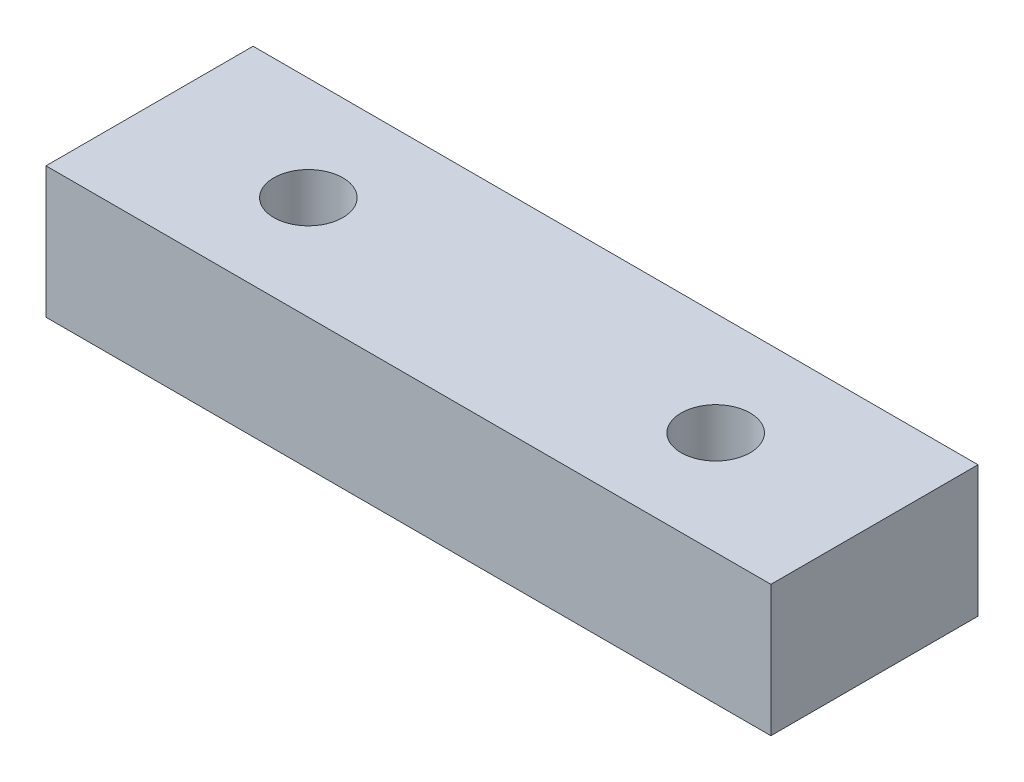
ISO-10303-21;
HEADER;
FILE_DESCRIPTION(('STEP AP214'),'2;1');
FILE_NAME('part.step','',(''),(''),'','','');
FILE_SCHEMA(('AUTOMOTIVE_DESIGN { 1 0 10303 214 1 1 1 1 }'));
ENDSEC;
DATA;
#1=APPLICATION_CONTEXT('core data for automotive mechanical design processes');
#2=APPLICATION_PROTOCOL_DEFINITION('international standard','automotive_design',2000,#1);
#3=PRODUCT_CONTEXT('',#1,'mechanical');
#4=PRODUCT('Part','Part','',(#3));
#5=PRODUCT_RELATED_PRODUCT_CATEGORY('part','',(#4));
#6=PRODUCT_DEFINITION_FORMATION('','',#4);
#7=PRODUCT_DEFINITION_CONTEXT('part definition',#1,'design');
#8=PRODUCT_DEFINITION('design','',#6,#7);
#9=PRODUCT_DEFINITION_SHAPE('','',#8);
#10=(LENGTH_UNIT() NAMED_UNIT(*) SI_UNIT(.MILLI.,.METRE.));
#11=(NAMED_UNIT(*) PLANE_ANGLE_UNIT() SI_UNIT($,.RADIAN.));
#12=(NAMED_UNIT(*) SI_UNIT($,.STERADIAN.) SOLID_ANGLE_UNIT());
#13=UNCERTAINTY_MEASURE_WITH_UNIT(LENGTH_MEASURE(1.E-05),#10,'distance_accuracy_value','');
#14=(GEOMETRIC_REPRESENTATION_CONTEXT(3) GLOBAL_UNCERTAINTY_ASSIGNED_CONTEXT((#13)) GLOBAL_UNIT_ASSIGNED_CONTEXT((#10,
#11,#12)) REPRESENTATION_CONTEXT('',''));
#15=CARTESIAN_POINT('',(0.,0.,0.));
#16=DIRECTION('',(0.,0.,1.));
#17=DIRECTION('',(1.,0.,0.));
#18=AXIS2_PLACEMENT_3D('',#15,#16,#17);
#19=CARTESIAN_POINT('',(0.,3.8,0.));
#20=DIRECTION('',(0.,-1.,0.));
#21=DIRECTION('',(0.,0.,-1.));
#22=AXIS2_PLACEMENT_3D('',#19,#20,#21);
#23=PLANE('',#22);
#24=DIRECTION('',(0.,0.,1.));
#25=VECTOR('',#24,1.);
#26=CARTESIAN_POINT('',(-73.0102049309709,3.8,-3.59999999999999));
#27=LINE('',#26,#25);
#28=CARTESIAN_POINT('',(-73.0102049309709,3.8,-9.59999999999999));
#29=VERTEX_POINT('',#28);
#30=CARTESIAN_POINT('',(-73.0102049309709,3.8,-3.59999999999999));
#31=VERTEX_POINT('',#30);
#32=EDGE_CURVE('E92',#29,#31,#27,.T.);
#33=ORIENTED_EDGE('',*,*,#32,.T.);
#34=DIRECTION('',(1.,0.,0.));
#35=VECTOR('',#34,1.);
#36=CARTESIAN_POINT('',(-73.0102049309709,3.8,-3.59999999999999));
#37=LINE('',#36,#35);
#38=CARTESIAN_POINT('',(-52.0102049309709,3.8,-3.59999999999999));
#39=VERTEX_POINT('',#38);
#40=EDGE_CURVE('E87',#31,#39,#37,.T.);
#41=ORIENTED_EDGE('',*,*,#40,.T.);
#42=DIRECTION('',(0.,0.,-1.));
#43=VECTOR('',#42,1.);
#44=CARTESIAN_POINT('',(-52.0102049309709,3.8,-3.59999999999999));
#45=LINE('',#44,#43);
#46=CARTESIAN_POINT('',(-52.0102049309709,3.8,-9.6));
#47=VERTEX_POINT('',#46);
#48=EDGE_CURVE('E90',#39,#47,#45,.T.);
#49=ORIENTED_EDGE('',*,*,#48,.T.);
#50=DIRECTION('',(-1.,0.,0.));
#51=VECTOR('',#50,1.);
#52=CARTESIAN_POINT('',(-73.0102049309709,3.8,-9.59999999999999));
#53=LINE('',#52,#51);
#54=EDGE_CURVE('E57',#47,#29,#53,.T.);
#55=ORIENTED_EDGE('',*,*,#54,.T.);
#56=EDGE_LOOP('',(#33,#41,#49,#55));
#57=FACE_BOUND('',#56,.T.);
#58=CARTESIAN_POINT('',(-56.6102049309709,3.8,-6.59999999999999));
#59=DIRECTION('',(0.,1.,0.));
#60=DIRECTION('',(0.,0.,1.));
#61=AXIS2_PLACEMENT_3D('',#58,#59,#60);
#62=CIRCLE('',#61,0.999999999999998);
#63=CARTESIAN_POINT('',(-56.6102049309709,3.8,-7.59999999999999));
#64=VERTEX_POINT('',#63);
#65=EDGE_CURVE('E112',#64,#64,#62,.T.);
#66=ORIENTED_EDGE('',*,*,#65,.F.);
#67=EDGE_LOOP('',(#66));
#68=FACE_BOUND('',#67,.T.);
#69=CARTESIAN_POINT('',(-68.4102049309709,3.8,-6.59999999999999));
#70=DIRECTION('',(0.,1.,0.));
#71=DIRECTION('',(0.,0.,1.));
#72=AXIS2_PLACEMENT_3D('',#69,#70,#71);
#73=CIRCLE('',#72,0.999999999999998);
#74=CARTESIAN_POINT('',(-68.4102049309709,3.8,-7.59999999999999));
#75=VERTEX_POINT('',#74);
#76=EDGE_CURVE('E134',#75,#75,#73,.T.);
#77=ORIENTED_EDGE('',*,*,#76,.F.);
#78=EDGE_LOOP('',(#77));
#79=FACE_BOUND('',#78,.T.);
#80=ADVANCED_FACE('F39',(#57,#68,#79),#23,.F.);
#81=CARTESIAN_POINT('',(0.,0.,0.));
#82=DIRECTION('',(0.,-1.,0.));
#83=DIRECTION('',(0.,0.,-1.));
#84=AXIS2_PLACEMENT_3D('',#81,#82,#83);
#85=PLANE('',#84);
#86=CARTESIAN_POINT('',(-56.6102049309709,0.,-6.59999999999999));
#87=DIRECTION('',(0.,1.,0.));
#88=DIRECTION('',(0.,0.,1.));
#89=AXIS2_PLACEMENT_3D('',#86,#87,#88);
#90=CIRCLE('',#89,0.999999999999998);
#91=CARTESIAN_POINT('',(-56.6102049309709,0.,-7.59999999999999));
#92=VERTEX_POINT('',#91);
#93=EDGE_CURVE('E130',#92,#92,#90,.T.);
#94=ORIENTED_EDGE('',*,*,#93,.T.);
#95=EDGE_LOOP('',(#94));
#96=FACE_BOUND('',#95,.T.);
#97=DIRECTION('',(0.,0.,1.));
#98=VECTOR('',#97,1.);
#99=CARTESIAN_POINT('',(-73.0102049309709,0.,-3.59999999999999));
#100=LINE('',#99,#98);
#101=CARTESIAN_POINT('',(-73.0102049309709,0.,-9.59999999999999));
#102=VERTEX_POINT('',#101);
#103=CARTESIAN_POINT('',(-73.0102049309709,0.,-3.59999999999999));
#104=VERTEX_POINT('',#103);
#105=EDGE_CURVE('E108',#102,#104,#100,.T.);
#106=ORIENTED_EDGE('',*,*,#105,.F.);
#107=DIRECTION('',(-1.,0.,0.));
#108=VECTOR('',#107,1.);
#109=CARTESIAN_POINT('',(-73.0102049309709,0.,-9.59999999999999));
#110=LINE('',#109,#108);
#111=CARTESIAN_POINT('',(-52.0102049309709,0.,-9.6));
#112=VERTEX_POINT('',#111);
#113=EDGE_CURVE('E80',#112,#102,#110,.T.);
#114=ORIENTED_EDGE('',*,*,#113,.F.);
#115=DIRECTION('',(0.,0.,-1.));
#116=VECTOR('',#115,1.);
#117=CARTESIAN_POINT('',(-52.0102049309709,0.,-3.59999999999999));
#118=LINE('',#117,#116);
#119=CARTESIAN_POINT('',(-52.0102049309709,0.,-3.59999999999999));
#120=VERTEX_POINT('',#119);
#121=EDGE_CURVE('E74',#120,#112,#118,.T.);
#122=ORIENTED_EDGE('',*,*,#121,.F.);
#123=DIRECTION('',(1.,0.,0.));
#124=VECTOR('',#123,1.);
#125=CARTESIAN_POINT('',(-73.0102049309709,0.,-3.59999999999999));
#126=LINE('',#125,#124);
#127=EDGE_CURVE('E97',#104,#120,#126,.T.);
#128=ORIENTED_EDGE('',*,*,#127,.F.);
#129=EDGE_LOOP('',(#106,#114,#122,#128));
#130=FACE_BOUND('',#129,.T.);
#131=CARTESIAN_POINT('',(-68.4102049309709,0.,-6.59999999999999));
#132=DIRECTION('',(0.,1.,0.));
#133=DIRECTION('',(0.,0.,1.));
#134=AXIS2_PLACEMENT_3D('',#131,#132,#133);
#135=CIRCLE('',#134,0.999999999999998);
#136=CARTESIAN_POINT('',(-68.4102049309709,0.,-7.59999999999999));
#137=VERTEX_POINT('',#136);
#138=EDGE_CURVE('E138',#137,#137,#135,.T.);
#139=ORIENTED_EDGE('',*,*,#138,.T.);
#140=EDGE_LOOP('',(#139));
#141=FACE_BOUND('',#140,.T.);
#142=ADVANCED_FACE('F125',(#96,#130,#141),#85,.T.);
#143=CARTESIAN_POINT('',(-73.0102049309709,3.8,-3.59999999999999));
#144=DIRECTION('',(1.,0.,0.));
#145=DIRECTION('',(0.,0.,-1.));
#146=AXIS2_PLACEMENT_3D('',#143,#144,#145);
#147=PLANE('',#146);
#148=ORIENTED_EDGE('',*,*,#105,.T.);
#149=DIRECTION('',(0.,-1.,0.));
#150=VECTOR('',#149,1.);
#151=CARTESIAN_POINT('',(-73.0102049309709,3.8,-3.59999999999999));
#152=LINE('',#151,#150);
#153=EDGE_CURVE('E11',#31,#104,#152,.T.);
#154=ORIENTED_EDGE('',*,*,#153,.F.);
#155=ORIENTED_EDGE('',*,*,#32,.F.);
#156=DIRECTION('',(0.,-1.,0.));
#157=VECTOR('',#156,1.);
#158=CARTESIAN_POINT('',(-73.0102049309709,3.8,-9.59999999999999));
#159=LINE('',#158,#157);
#160=EDGE_CURVE('E104',#29,#102,#159,.T.);
#161=ORIENTED_EDGE('',*,*,#160,.T.);
#162=EDGE_LOOP('',(#148,#154,#155,#161));
#163=FACE_BOUND('',#162,.T.);
#164=ADVANCED_FACE('F41',(#163),#147,.F.);
#165=CARTESIAN_POINT('',(-73.0102049309709,3.8,-3.59999999999999));
#166=DIRECTION('',(0.,0.,-1.));
#167=DIRECTION('',(-1.,0.,0.));
#168=AXIS2_PLACEMENT_3D('',#165,#166,#167);
#169=PLANE('',#168);
#170=ORIENTED_EDGE('',*,*,#127,.T.);
#171=DIRECTION('',(0.,-1.,0.));
#172=VECTOR('',#171,1.);
#173=CARTESIAN_POINT('',(-52.0102049309709,3.8,-3.59999999999999));
#174=LINE('',#173,#172);
#175=EDGE_CURVE('E49',#39,#120,#174,.T.);
#176=ORIENTED_EDGE('',*,*,#175,.F.);
#177=ORIENTED_EDGE('',*,*,#40,.F.);
#178=ORIENTED_EDGE('',*,*,#153,.T.);
#179=EDGE_LOOP('',(#170,#176,#177,#178));
#180=FACE_BOUND('',#179,.T.);
#181=ADVANCED_FACE('F96',(#180),#169,.F.);
#182=CARTESIAN_POINT('',(-52.0102049309709,3.8,-3.59999999999999));
#183=DIRECTION('',(-1.,0.,0.));
#184=DIRECTION('',(0.,0.,1.));
#185=AXIS2_PLACEMENT_3D('',#182,#183,#184);
#186=PLANE('',#185);
#187=ORIENTED_EDGE('',*,*,#121,.T.);
#188=DIRECTION('',(0.,-1.,0.));
#189=VECTOR('',#188,1.);
#190=CARTESIAN_POINT('',(-52.0102049309709,3.8,-9.6));
#191=LINE('',#190,#189);
#192=EDGE_CURVE('E99',#47,#112,#191,.T.);
#193=ORIENTED_EDGE('',*,*,#192,.F.);
#194=ORIENTED_EDGE('',*,*,#48,.F.);
#195=ORIENTED_EDGE('',*,*,#175,.T.);
#196=EDGE_LOOP('',(#187,#193,#194,#195));
#197=FACE_BOUND('',#196,.T.);
#198=ADVANCED_FACE('F100',(#197),#186,.F.);
#199=CARTESIAN_POINT('',(-73.0102049309709,3.8,-9.59999999999999));
#200=DIRECTION('',(0.,0.,1.));
#201=DIRECTION('',(1.,0.,0.));
#202=AXIS2_PLACEMENT_3D('',#199,#200,#201);
#203=PLANE('',#202);
#204=ORIENTED_EDGE('',*,*,#113,.T.);
#205=ORIENTED_EDGE('',*,*,#160,.F.);
#206=ORIENTED_EDGE('',*,*,#54,.F.);
#207=ORIENTED_EDGE('',*,*,#192,.T.);
#208=EDGE_LOOP('',(#204,#205,#206,#207));
#209=FACE_BOUND('',#208,.T.);
#210=ADVANCED_FACE('F122',(#209),#203,.F.);
#211=CARTESIAN_POINT('',(-56.6102049309709,3.8,-6.59999999999999));
#212=DIRECTION('',(0.,-1.,0.));
#213=DIRECTION('',(0.,0.,-1.));
#214=AXIS2_PLACEMENT_3D('',#211,#212,#213);
#215=CYLINDRICAL_SURFACE('',#214,0.999999999999998);
#216=CARTESIAN_POINT('',(-56.6102049309709,3.8,-7.59999999999999));
#217=CARTESIAN_POINT('',(-56.6102049309709,3.76041666666667,-7.59999999999999));
#218=CARTESIAN_POINT('',(-56.6102049309709,3.72083333333333,-7.59999999999999));
#219=CARTESIAN_POINT('',(-56.6102049309709,3.64166666666667,-7.59999999999999));
#220=CARTESIAN_POINT('',(-56.6102049309709,3.60208333333333,-7.59999999999999));
#221=CARTESIAN_POINT('',(-56.6102049309709,3.52291666666667,-7.59999999999999));
#222=CARTESIAN_POINT('',(-56.6102049309709,3.48333333333333,-7.59999999999999));
#223=CARTESIAN_POINT('',(-56.6102049309709,3.40416666666667,-7.59999999999999));
#224=CARTESIAN_POINT('',(-56.6102049309709,3.36458333333333,-7.59999999999999));
#225=CARTESIAN_POINT('',(-56.6102049309709,3.28541666666667,-7.59999999999999));
#226=CARTESIAN_POINT('',(-56.6102049309709,3.24583333333333,-7.59999999999999));
#227=CARTESIAN_POINT('',(-56.6102049309709,3.16666666666667,-7.59999999999999));
#228=CARTESIAN_POINT('',(-56.6102049309709,3.12708333333333,-7.59999999999999));
#229=CARTESIAN_POINT('',(-56.6102049309709,3.04791666666667,-7.59999999999999));
#230=CARTESIAN_POINT('',(-56.6102049309709,3.00833333333333,-7.59999999999999));
#231=CARTESIAN_POINT('',(-56.6102049309709,2.92916666666667,-7.59999999999999));
#232=CARTESIAN_POINT('',(-56.6102049309709,2.88958333333333,-7.59999999999999));
#233=CARTESIAN_POINT('',(-56.6102049309709,2.81041666666667,-7.59999999999999));
#234=CARTESIAN_POINT('',(-56.6102049309709,2.77083333333333,-7.59999999999999));
#235=CARTESIAN_POINT('',(-56.6102049309709,2.69166666666667,-7.59999999999999));
#236=CARTESIAN_POINT('',(-56.6102049309709,2.65208333333333,-7.59999999999999));
#237=CARTESIAN_POINT('',(-56.6102049309709,2.57291666666667,-7.59999999999999));
#238=CARTESIAN_POINT('',(-56.6102049309709,2.53333333333333,-7.59999999999999));
#239=CARTESIAN_POINT('',(-56.6102049309709,2.45416666666667,-7.59999999999999));
#240=CARTESIAN_POINT('',(-56.6102049309709,2.41458333333333,-7.59999999999999));
#241=CARTESIAN_POINT('',(-56.6102049309709,2.33541666666667,-7.59999999999999));
#242=CARTESIAN_POINT('',(-56.6102049309709,2.29583333333333,-7.59999999999999));
#243=CARTESIAN_POINT('',(-56.6102049309709,2.21666666666667,-7.59999999999999));
#244=CARTESIAN_POINT('',(-56.6102049309709,2.17708333333333,-7.59999999999999));
#245=CARTESIAN_POINT('',(-56.6102049309709,2.09791666666667,-7.59999999999999));
#246=CARTESIAN_POINT('',(-56.6102049309709,2.05833333333333,-7.59999999999999));
#247=CARTESIAN_POINT('',(-56.6102049309709,1.97916666666667,-7.59999999999999));
#248=CARTESIAN_POINT('',(-56.6102049309709,1.93958333333333,-7.59999999999999));
#249=CARTESIAN_POINT('',(-56.6102049309709,1.86041666666667,-7.59999999999999));
#250=CARTESIAN_POINT('',(-56.6102049309709,1.82083333333333,-7.59999999999999));
#251=CARTESIAN_POINT('',(-56.6102049309709,1.74166666666667,-7.59999999999999));
#252=CARTESIAN_POINT('',(-56.6102049309709,1.70208333333333,-7.59999999999999));
#253=CARTESIAN_POINT('',(-56.6102049309709,1.62291666666667,-7.59999999999999));
#254=CARTESIAN_POINT('',(-56.6102049309709,1.58333333333333,-7.59999999999999));
#255=CARTESIAN_POINT('',(-56.6102049309709,1.50416666666667,-7.59999999999999));
#256=CARTESIAN_POINT('',(-56.6102049309709,1.46458333333333,-7.59999999999999));
#257=CARTESIAN_POINT('',(-56.6102049309709,1.38541666666667,-7.59999999999999));
#258=CARTESIAN_POINT('',(-56.6102049309709,1.34583333333333,-7.59999999999999));
#259=CARTESIAN_POINT('',(-56.6102049309709,1.26666666666667,-7.59999999999999));
#260=CARTESIAN_POINT('',(-56.6102049309709,1.22708333333333,-7.59999999999999));
#261=CARTESIAN_POINT('',(-56.6102049309709,1.14791666666667,-7.59999999999999));
#262=CARTESIAN_POINT('',(-56.6102049309709,1.10833333333333,-7.59999999999999));
#263=CARTESIAN_POINT('',(-56.6102049309709,1.02916666666667,-7.59999999999999));
#264=CARTESIAN_POINT('',(-56.6102049309709,0.989583333333333,-7.59999999999999));
#265=CARTESIAN_POINT('',(-56.6102049309709,0.910416666666667,-7.59999999999999));
#266=CARTESIAN_POINT('',(-56.6102049309709,0.870833333333333,-7.59999999999999));
#267=CARTESIAN_POINT('',(-56.6102049309709,0.791666666666667,-7.59999999999999));
#268=CARTESIAN_POINT('',(-56.6102049309709,0.752083333333333,-7.59999999999999));
#269=CARTESIAN_POINT('',(-56.6102049309709,0.672916666666667,-7.59999999999999));
#270=CARTESIAN_POINT('',(-56.6102049309709,0.633333333333333,-7.59999999999999));
#271=CARTESIAN_POINT('',(-56.6102049309709,0.554166666666667,-7.59999999999999));
#272=CARTESIAN_POINT('',(-56.6102049309709,0.514583333333334,-7.59999999999999));
#273=CARTESIAN_POINT('',(-56.6102049309709,0.435416666666667,-7.59999999999999));
#274=CARTESIAN_POINT('',(-56.6102049309709,0.395833333333333,-7.59999999999999));
#275=CARTESIAN_POINT('',(-56.6102049309709,0.316666666666666,-7.59999999999999));
#276=CARTESIAN_POINT('',(-56.6102049309709,0.277083333333333,-7.59999999999999));
#277=CARTESIAN_POINT('',(-56.6102049309709,0.197916666666667,-7.59999999999999));
#278=CARTESIAN_POINT('',(-56.6102049309709,0.158333333333333,-7.59999999999999));
#279=CARTESIAN_POINT('',(-56.6102049309709,0.0791666666666666,-7.59999999999999));
#280=CARTESIAN_POINT('',(-56.6102049309709,0.0395833333333333,-7.59999999999999));
#281=CARTESIAN_POINT('',(-56.6102049309709,0.,-7.59999999999999));
#282=B_SPLINE_CURVE_WITH_KNOTS('',3,(#216,#217,#218,#219,#220,#221,#222,#223,#224,#225,#226,
#227,#228,#229,#230,#231,#232,#233,#234,#235,#236,#237,#238,#239,#240,#241,#242,#243,#244,#245,
#246,#247,#248,#249,#250,#251,#252,#253,#254,#255,#256,#257,#258,#259,#260,#261,#262,#263,#264,
#265,#266,#267,#268,#269,#270,#271,#272,#273,#274,#275,#276,#277,#278,#279,#280,#281),
.UNSPECIFIED.,.F.,.F.,(4,2,2,2,2,2,2,2,2,2,2,2,2,2,2,2,2,2,2,2,2,2,2,2,2,2,2,2,2,2,2,2,4),(0.,
0.11875,0.2375,0.35625,0.475,0.59375,0.7125,0.831249999999999,0.95,1.06875,1.1875,1.30625,1.425,
1.54375,1.6625,1.78125,1.9,2.01875,2.1375,2.25625,2.375,2.49375,2.6125,2.73125,2.85,2.96875,
3.0875,3.20625,3.325,3.44375,3.5625,3.68125,3.8),.UNSPECIFIED.);
#283=EDGE_CURVE('BSEAM157',#64,#92,#282,.T.);
#284=ORIENTED_EDGE('',*,*,#65,.T.);
#285=ORIENTED_EDGE('',*,*,#93,.F.);
#286=ORIENTED_EDGE('',*,*,#283,.T.);
#287=ORIENTED_EDGE('',*,*,#283,.F.);
#288=EDGE_LOOP('',(#284,#286,#285,#287));
#289=FACE_BOUND('',#288,.T.);
#290=ADVANCED_FACE('F157',(#289),#215,.F.);
#291=CARTESIAN_POINT('',(-68.4102049309709,3.8,-6.59999999999999));
#292=DIRECTION('',(0.,-1.,0.));
#293=DIRECTION('',(0.,0.,-1.));
#294=AXIS2_PLACEMENT_3D('',#291,#292,#293);
#295=CYLINDRICAL_SURFACE('',#294,0.999999999999998);
#296=CARTESIAN_POINT('',(-68.4102049309709,3.8,-7.59999999999999));
#297=CARTESIAN_POINT('',(-68.4102049309709,3.76041666666667,-7.59999999999999));
#298=CARTESIAN_POINT('',(-68.4102049309709,3.72083333333333,-7.59999999999999));
#299=CARTESIAN_POINT('',(-68.4102049309709,3.64166666666667,-7.59999999999999));
#300=CARTESIAN_POINT('',(-68.4102049309709,3.60208333333333,-7.59999999999999));
#301=CARTESIAN_POINT('',(-68.4102049309709,3.52291666666667,-7.59999999999999));
#302=CARTESIAN_POINT('',(-68.4102049309709,3.48333333333333,-7.59999999999999));
#303=CARTESIAN_POINT('',(-68.4102049309709,3.40416666666667,-7.59999999999999));
#304=CARTESIAN_POINT('',(-68.4102049309709,3.36458333333333,-7.59999999999999));
#305=CARTESIAN_POINT('',(-68.4102049309709,3.28541666666667,-7.59999999999999));
#306=CARTESIAN_POINT('',(-68.4102049309709,3.24583333333333,-7.59999999999999));
#307=CARTESIAN_POINT('',(-68.4102049309709,3.16666666666667,-7.59999999999999));
#308=CARTESIAN_POINT('',(-68.4102049309709,3.12708333333333,-7.59999999999999));
#309=CARTESIAN_POINT('',(-68.4102049309709,3.04791666666667,-7.59999999999999));
#310=CARTESIAN_POINT('',(-68.4102049309709,3.00833333333333,-7.59999999999999));
#311=CARTESIAN_POINT('',(-68.4102049309709,2.92916666666667,-7.59999999999999));
#312=CARTESIAN_POINT('',(-68.4102049309709,2.88958333333333,-7.59999999999999));
#313=CARTESIAN_POINT('',(-68.4102049309709,2.81041666666667,-7.59999999999999));
#314=CARTESIAN_POINT('',(-68.4102049309709,2.77083333333333,-7.59999999999999));
#315=CARTESIAN_POINT('',(-68.4102049309709,2.69166666666667,-7.59999999999999));
#316=CARTESIAN_POINT('',(-68.4102049309709,2.65208333333333,-7.59999999999999));
#317=CARTESIAN_POINT('',(-68.4102049309709,2.57291666666667,-7.59999999999999));
#318=CARTESIAN_POINT('',(-68.4102049309709,2.53333333333333,-7.59999999999999));
#319=CARTESIAN_POINT('',(-68.4102049309709,2.45416666666667,-7.59999999999999));
#320=CARTESIAN_POINT('',(-68.4102049309709,2.41458333333333,-7.59999999999999));
#321=CARTESIAN_POINT('',(-68.4102049309709,2.33541666666667,-7.59999999999999));
#322=CARTESIAN_POINT('',(-68.4102049309709,2.29583333333333,-7.59999999999999));
#323=CARTESIAN_POINT('',(-68.4102049309709,2.21666666666667,-7.59999999999999));
#324=CARTESIAN_POINT('',(-68.4102049309709,2.17708333333333,-7.59999999999999));
#325=CARTESIAN_POINT('',(-68.4102049309709,2.09791666666667,-7.59999999999999));
#326=CARTESIAN_POINT('',(-68.4102049309709,2.05833333333333,-7.59999999999999));
#327=CARTESIAN_POINT('',(-68.4102049309709,1.97916666666667,-7.59999999999999));
#328=CARTESIAN_POINT('',(-68.4102049309709,1.93958333333333,-7.59999999999999));
#329=CARTESIAN_POINT('',(-68.4102049309709,1.86041666666667,-7.59999999999999));
#330=CARTESIAN_POINT('',(-68.4102049309709,1.82083333333333,-7.59999999999999));
#331=CARTESIAN_POINT('',(-68.4102049309709,1.74166666666667,-7.59999999999999));
#332=CARTESIAN_POINT('',(-68.4102049309709,1.70208333333333,-7.59999999999999));
#333=CARTESIAN_POINT('',(-68.4102049309709,1.62291666666667,-7.59999999999999));
#334=CARTESIAN_POINT('',(-68.4102049309709,1.58333333333333,-7.59999999999999));
#335=CARTESIAN_POINT('',(-68.4102049309709,1.50416666666667,-7.59999999999999));
#336=CARTESIAN_POINT('',(-68.4102049309709,1.46458333333333,-7.59999999999999));
#337=CARTESIAN_POINT('',(-68.4102049309709,1.38541666666667,-7.59999999999999));
#338=CARTESIAN_POINT('',(-68.4102049309709,1.34583333333333,-7.59999999999999));
#339=CARTESIAN_POINT('',(-68.4102049309709,1.26666666666667,-7.59999999999999));
#340=CARTESIAN_POINT('',(-68.4102049309709,1.22708333333333,-7.59999999999999));
#341=CARTESIAN_POINT('',(-68.4102049309709,1.14791666666667,-7.59999999999999));
#342=CARTESIAN_POINT('',(-68.4102049309709,1.10833333333333,-7.59999999999999));
#343=CARTESIAN_POINT('',(-68.4102049309709,1.02916666666667,-7.59999999999999));
#344=CARTESIAN_POINT('',(-68.4102049309709,0.989583333333333,-7.59999999999999));
#345=CARTESIAN_POINT('',(-68.4102049309709,0.910416666666667,-7.59999999999999));
#346=CARTESIAN_POINT('',(-68.4102049309709,0.870833333333333,-7.59999999999999));
#347=CARTESIAN_POINT('',(-68.4102049309709,0.791666666666667,-7.59999999999999));
#348=CARTESIAN_POINT('',(-68.4102049309709,0.752083333333333,-7.59999999999999));
#349=CARTESIAN_POINT('',(-68.4102049309709,0.672916666666667,-7.59999999999999));
#350=CARTESIAN_POINT('',(-68.4102049309709,0.633333333333333,-7.59999999999999));
#351=CARTESIAN_POINT('',(-68.4102049309709,0.554166666666667,-7.59999999999999));
#352=CARTESIAN_POINT('',(-68.4102049309709,0.514583333333334,-7.59999999999999));
#353=CARTESIAN_POINT('',(-68.4102049309709,0.435416666666667,-7.59999999999999));
#354=CARTESIAN_POINT('',(-68.4102049309709,0.395833333333333,-7.59999999999999));
#355=CARTESIAN_POINT('',(-68.4102049309709,0.316666666666666,-7.59999999999999));
#356=CARTESIAN_POINT('',(-68.4102049309709,0.277083333333333,-7.59999999999999));
#357=CARTESIAN_POINT('',(-68.4102049309709,0.197916666666667,-7.59999999999999));
#358=CARTESIAN_POINT('',(-68.4102049309709,0.158333333333333,-7.59999999999999));
#359=CARTESIAN_POINT('',(-68.4102049309709,0.0791666666666666,-7.59999999999999));
#360=CARTESIAN_POINT('',(-68.4102049309709,0.0395833333333333,-7.59999999999999));
#361=CARTESIAN_POINT('',(-68.4102049309709,0.,-7.59999999999999));
#362=B_SPLINE_CURVE_WITH_KNOTS('',3,(#296,#297,#298,#299,#300,#301,#302,#303,#304,#305,#306,
#307,#308,#309,#310,#311,#312,#313,#314,#315,#316,#317,#318,#319,#320,#321,#322,#323,#324,#325,
#326,#327,#328,#329,#330,#331,#332,#333,#334,#335,#336,#337,#338,#339,#340,#341,#342,#343,#344,
#345,#346,#347,#348,#349,#350,#351,#352,#353,#354,#355,#356,#357,#358,#359,#360,#361),
.UNSPECIFIED.,.F.,.F.,(4,2,2,2,2,2,2,2,2,2,2,2,2,2,2,2,2,2,2,2,2,2,2,2,2,2,2,2,2,2,2,2,4),(0.,
0.11875,0.2375,0.35625,0.475,0.59375,0.7125,0.831249999999999,0.95,1.06875,1.1875,1.30625,1.425,
1.54375,1.6625,1.78125,1.9,2.01875,2.1375,2.25625,2.375,2.49375,2.6125,2.73125,2.85,2.96875,
3.0875,3.20625,3.325,3.44375,3.5625,3.68125,3.8),.UNSPECIFIED.);
#363=EDGE_CURVE('BSEAM146',#75,#137,#362,.T.);
#364=ORIENTED_EDGE('',*,*,#76,.T.);
#365=ORIENTED_EDGE('',*,*,#138,.F.);
#366=ORIENTED_EDGE('',*,*,#363,.T.);
#367=ORIENTED_EDGE('',*,*,#363,.F.);
#368=EDGE_LOOP('',(#364,#366,#365,#367));
#369=FACE_BOUND('',#368,.T.);
#370=ADVANCED_FACE('F146',(#369),#295,.F.);
#371=CLOSED_SHELL('',(#80,#142,#164,#181,#198,#210,#290,#370));
#372=MANIFOLD_SOLID_BREP('B2',#371);
#373=ADVANCED_BREP_SHAPE_REPRESENTATION('',(#18,#372),#14);
#374=SHAPE_DEFINITION_REPRESENTATION(#9,#373);
ENDSEC;
END-ISO-10303-21;
